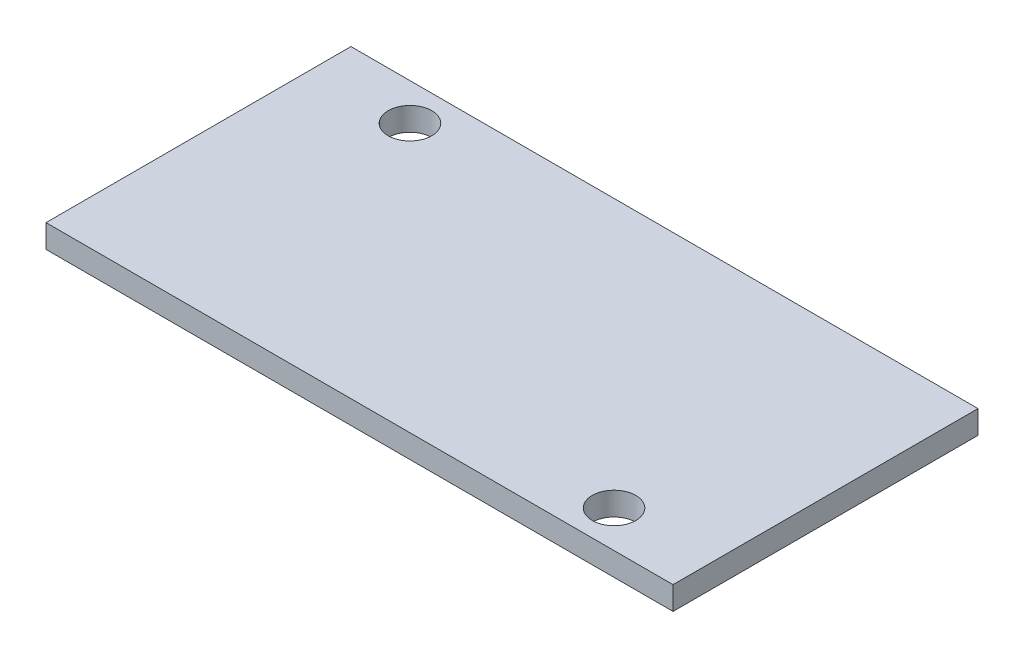
ISO-10303-21;
HEADER;
FILE_DESCRIPTION(('STEP AP214'),'2;1');
FILE_NAME('part.step','',(''),(''),'','','');
FILE_SCHEMA(('AUTOMOTIVE_DESIGN { 1 0 10303 214 1 1 1 1 }'));
ENDSEC;
DATA;
#1=APPLICATION_CONTEXT('core data for automotive mechanical design processes');
#2=APPLICATION_PROTOCOL_DEFINITION('international standard','automotive_design',2000,#1);
#3=PRODUCT_CONTEXT('',#1,'mechanical');
#4=PRODUCT('Part','Part','',(#3));
#5=PRODUCT_RELATED_PRODUCT_CATEGORY('part','',(#4));
#6=PRODUCT_DEFINITION_FORMATION('','',#4);
#7=PRODUCT_DEFINITION_CONTEXT('part definition',#1,'design');
#8=PRODUCT_DEFINITION('design','',#6,#7);
#9=PRODUCT_DEFINITION_SHAPE('','',#8);
#10=(LENGTH_UNIT() NAMED_UNIT(*) SI_UNIT(.MILLI.,.METRE.));
#11=(NAMED_UNIT(*) PLANE_ANGLE_UNIT() SI_UNIT($,.RADIAN.));
#12=(NAMED_UNIT(*) SI_UNIT($,.STERADIAN.) SOLID_ANGLE_UNIT());
#13=UNCERTAINTY_MEASURE_WITH_UNIT(LENGTH_MEASURE(1.E-05),#10,'distance_accuracy_value','');
#14=(GEOMETRIC_REPRESENTATION_CONTEXT(3) GLOBAL_UNCERTAINTY_ASSIGNED_CONTEXT((#13)) GLOBAL_UNIT_ASSIGNED_CONTEXT((#10,
#11,#12)) REPRESENTATION_CONTEXT('',''));
#15=CARTESIAN_POINT('',(0.,0.,0.));
#16=DIRECTION('',(0.,0.,1.));
#17=DIRECTION('',(1.,0.,0.));
#18=AXIS2_PLACEMENT_3D('',#15,#16,#17);
#19=CARTESIAN_POINT('',(-21.59,1.6,-10.5));
#20=DIRECTION('',(1.,0.,0.));
#21=DIRECTION('',(0.,0.,-1.));
#22=AXIS2_PLACEMENT_3D('',#19,#20,#21);
#23=PLANE('',#22);
#24=DIRECTION('',(0.,0.,1.));
#25=VECTOR('',#24,1.);
#26=CARTESIAN_POINT('',(-21.59,0.,-10.5));
#27=LINE('',#26,#25);
#28=CARTESIAN_POINT('',(-21.59,0.,-10.5));
#29=VERTEX_POINT('',#28);
#30=CARTESIAN_POINT('',(-21.59,0.,10.5));
#31=VERTEX_POINT('',#30);
#32=EDGE_CURVE('E103',#29,#31,#27,.T.);
#33=ORIENTED_EDGE('',*,*,#32,.T.);
#34=DIRECTION('',(0.,-1.,0.));
#35=VECTOR('',#34,1.);
#36=CARTESIAN_POINT('',(-21.59,1.6,10.5));
#37=LINE('',#36,#35);
#38=CARTESIAN_POINT('',(-21.59,1.6,10.5));
#39=VERTEX_POINT('',#38);
#40=EDGE_CURVE('E11',#39,#31,#37,.T.);
#41=ORIENTED_EDGE('',*,*,#40,.F.);
#42=DIRECTION('',(0.,0.,1.));
#43=VECTOR('',#42,1.);
#44=CARTESIAN_POINT('',(-21.59,1.6,-10.5));
#45=LINE('',#44,#43);
#46=CARTESIAN_POINT('',(-21.59,1.6,-10.5));
#47=VERTEX_POINT('',#46);
#48=EDGE_CURVE('E90',#47,#39,#45,.T.);
#49=ORIENTED_EDGE('',*,*,#48,.F.);
#50=DIRECTION('',(0.,-1.,0.));
#51=VECTOR('',#50,1.);
#52=CARTESIAN_POINT('',(-21.59,1.6,-10.5));
#53=LINE('',#52,#51);
#54=EDGE_CURVE('E99',#47,#29,#53,.T.);
#55=ORIENTED_EDGE('',*,*,#54,.T.);
#56=EDGE_LOOP('',(#33,#41,#49,#55));
#57=FACE_BOUND('',#56,.T.);
#58=ADVANCED_FACE('F37',(#57),#23,.F.);
#59=CARTESIAN_POINT('',(-21.59,1.6,10.5));
#60=DIRECTION('',(0.,0.,-1.));
#61=DIRECTION('',(-1.,0.,0.));
#62=AXIS2_PLACEMENT_3D('',#59,#60,#61);
#63=PLANE('',#62);
#64=DIRECTION('',(1.,0.,0.));
#65=VECTOR('',#64,1.);
#66=CARTESIAN_POINT('',(-21.59,0.,10.5));
#67=LINE('',#66,#65);
#68=CARTESIAN_POINT('',(21.59,0.,10.5));
#69=VERTEX_POINT('',#68);
#70=EDGE_CURVE('E94',#31,#69,#67,.T.);
#71=ORIENTED_EDGE('',*,*,#70,.T.);
#72=DIRECTION('',(0.,-1.,0.));
#73=VECTOR('',#72,1.);
#74=CARTESIAN_POINT('',(21.59,1.6,10.5));
#75=LINE('',#74,#73);
#76=CARTESIAN_POINT('',(21.59,1.6,10.5));
#77=VERTEX_POINT('',#76);
#78=EDGE_CURVE('E46',#77,#69,#75,.T.);
#79=ORIENTED_EDGE('',*,*,#78,.F.);
#80=DIRECTION('',(1.,0.,0.));
#81=VECTOR('',#80,1.);
#82=CARTESIAN_POINT('',(-21.59,1.6,10.5));
#83=LINE('',#82,#81);
#84=EDGE_CURVE('E85',#39,#77,#83,.T.);
#85=ORIENTED_EDGE('',*,*,#84,.F.);
#86=ORIENTED_EDGE('',*,*,#40,.T.);
#87=EDGE_LOOP('',(#71,#79,#85,#86));
#88=FACE_BOUND('',#87,.T.);
#89=ADVANCED_FACE('F93',(#88),#63,.F.);
#90=CARTESIAN_POINT('',(21.59,1.6,-10.5));
#91=DIRECTION('',(-1.,0.,0.));
#92=DIRECTION('',(0.,0.,1.));
#93=AXIS2_PLACEMENT_3D('',#90,#91,#92);
#94=PLANE('',#93);
#95=DIRECTION('',(0.,0.,-1.));
#96=VECTOR('',#95,1.);
#97=CARTESIAN_POINT('',(21.59,0.,-10.5));
#98=LINE('',#97,#96);
#99=CARTESIAN_POINT('',(21.59,0.,-10.5));
#100=VERTEX_POINT('',#99);
#101=EDGE_CURVE('E72',#69,#100,#98,.T.);
#102=ORIENTED_EDGE('',*,*,#101,.T.);
#103=DIRECTION('',(0.,-1.,0.));
#104=VECTOR('',#103,1.);
#105=CARTESIAN_POINT('',(21.59,1.6,-10.5));
#106=LINE('',#105,#104);
#107=CARTESIAN_POINT('',(21.59,1.6,-10.5));
#108=VERTEX_POINT('',#107);
#109=EDGE_CURVE('E95',#108,#100,#106,.T.);
#110=ORIENTED_EDGE('',*,*,#109,.F.);
#111=DIRECTION('',(0.,0.,-1.));
#112=VECTOR('',#111,1.);
#113=CARTESIAN_POINT('',(21.59,1.6,-10.5));
#114=LINE('',#113,#112);
#115=EDGE_CURVE('E88',#77,#108,#114,.T.);
#116=ORIENTED_EDGE('',*,*,#115,.F.);
#117=ORIENTED_EDGE('',*,*,#78,.T.);
#118=EDGE_LOOP('',(#102,#110,#116,#117));
#119=FACE_BOUND('',#118,.T.);
#120=ADVANCED_FACE('F97',(#119),#94,.F.);
#121=CARTESIAN_POINT('',(-21.59,1.6,-10.5));
#122=DIRECTION('',(0.,0.,1.));
#123=DIRECTION('',(1.,0.,0.));
#124=AXIS2_PLACEMENT_3D('',#121,#122,#123);
#125=PLANE('',#124);
#126=DIRECTION('',(-1.,0.,0.));
#127=VECTOR('',#126,1.);
#128=CARTESIAN_POINT('',(-21.59,0.,-10.5));
#129=LINE('',#128,#127);
#130=EDGE_CURVE('E78',#100,#29,#129,.T.);
#131=ORIENTED_EDGE('',*,*,#130,.T.);
#132=ORIENTED_EDGE('',*,*,#54,.F.);
#133=DIRECTION('',(-1.,0.,0.));
#134=VECTOR('',#133,1.);
#135=CARTESIAN_POINT('',(-21.59,1.6,-10.5));
#136=LINE('',#135,#134);
#137=EDGE_CURVE('E55',#108,#47,#136,.T.);
#138=ORIENTED_EDGE('',*,*,#137,.F.);
#139=ORIENTED_EDGE('',*,*,#109,.T.);
#140=EDGE_LOOP('',(#131,#132,#138,#139));
#141=FACE_BOUND('',#140,.T.);
#142=ADVANCED_FACE('F131',(#141),#125,.F.);
#143=CARTESIAN_POINT('',(0.,1.6,0.));
#144=DIRECTION('',(0.,1.,0.));
#145=DIRECTION('',(0.,0.,1.));
#146=AXIS2_PLACEMENT_3D('',#143,#144,#145);
#147=PLANE('',#146);
#148=CARTESIAN_POINT('',(14.986,1.6,7.96));
#149=DIRECTION('',(0.,1.,0.));
#150=DIRECTION('',(0.,0.,1.));
#151=AXIS2_PLACEMENT_3D('',#148,#149,#150);
#152=CIRCLE('',#151,1.5);
#153=CARTESIAN_POINT('',(14.986,1.6,9.46));
#154=VERTEX_POINT('',#153);
#155=EDGE_CURVE('E120',#154,#154,#152,.T.);
#156=ORIENTED_EDGE('',*,*,#155,.F.);
#157=EDGE_LOOP('',(#156));
#158=FACE_BOUND('',#157,.T.);
#159=CARTESIAN_POINT('',(-14.986,1.6,-7.96));
#160=DIRECTION('',(0.,1.,0.));
#161=DIRECTION('',(0.,0.,1.));
#162=AXIS2_PLACEMENT_3D('',#159,#160,#161);
#163=CIRCLE('',#162,1.5);
#164=CARTESIAN_POINT('',(-14.986,1.6,-6.45999999999999));
#165=VERTEX_POINT('',#164);
#166=EDGE_CURVE('E112',#165,#165,#163,.T.);
#167=ORIENTED_EDGE('',*,*,#166,.F.);
#168=EDGE_LOOP('',(#167));
#169=FACE_BOUND('',#168,.T.);
#170=ORIENTED_EDGE('',*,*,#48,.T.);
#171=ORIENTED_EDGE('',*,*,#84,.T.);
#172=ORIENTED_EDGE('',*,*,#115,.T.);
#173=ORIENTED_EDGE('',*,*,#137,.T.);
#174=EDGE_LOOP('',(#170,#171,#172,#173));
#175=FACE_BOUND('',#174,.T.);
#176=ADVANCED_FACE('F86',(#158,#169,#175),#147,.T.);
#177=CARTESIAN_POINT('',(0.,0.,0.));
#178=DIRECTION('',(0.,1.,0.));
#179=DIRECTION('',(0.,0.,1.));
#180=AXIS2_PLACEMENT_3D('',#177,#178,#179);
#181=PLANE('',#180);
#182=CARTESIAN_POINT('',(14.986,0.,7.96));
#183=DIRECTION('',(0.,1.,0.));
#184=DIRECTION('',(0.,0.,1.));
#185=AXIS2_PLACEMENT_3D('',#182,#183,#184);
#186=CIRCLE('',#185,1.5);
#187=CARTESIAN_POINT('',(14.986,0.,9.46));
#188=VERTEX_POINT('',#187);
#189=EDGE_CURVE('E40',#188,#188,#186,.T.);
#190=ORIENTED_EDGE('',*,*,#189,.T.);
#191=EDGE_LOOP('',(#190));
#192=FACE_BOUND('',#191,.T.);
#193=CARTESIAN_POINT('',(-14.986,0.,-7.96));
#194=DIRECTION('',(0.,1.,0.));
#195=DIRECTION('',(0.,0.,1.));
#196=AXIS2_PLACEMENT_3D('',#193,#194,#195);
#197=CIRCLE('',#196,1.5);
#198=CARTESIAN_POINT('',(-14.986,0.,-6.45999999999999));
#199=VERTEX_POINT('',#198);
#200=EDGE_CURVE('E106',#199,#199,#197,.T.);
#201=ORIENTED_EDGE('',*,*,#200,.T.);
#202=EDGE_LOOP('',(#201));
#203=FACE_BOUND('',#202,.T.);
#204=ORIENTED_EDGE('',*,*,#32,.F.);
#205=ORIENTED_EDGE('',*,*,#130,.F.);
#206=ORIENTED_EDGE('',*,*,#101,.F.);
#207=ORIENTED_EDGE('',*,*,#70,.F.);
#208=EDGE_LOOP('',(#204,#205,#206,#207));
#209=FACE_BOUND('',#208,.T.);
#210=ADVANCED_FACE('F130',(#192,#203,#209),#181,.F.);
#211=CARTESIAN_POINT('',(-14.986,-8.4,-7.96));
#212=DIRECTION('',(0.,1.,0.));
#213=DIRECTION('',(0.,0.,1.));
#214=AXIS2_PLACEMENT_3D('',#211,#212,#213);
#215=CYLINDRICAL_SURFACE('',#214,1.5);
#216=ORIENTED_EDGE('',*,*,#166,.T.);
#217=EDGE_LOOP('',(#216));
#218=FACE_BOUND('',#217,.T.);
#219=ORIENTED_EDGE('',*,*,#200,.F.);
#220=EDGE_LOOP('',(#219));
#221=FACE_BOUND('',#220,.T.);
#222=ADVANCED_FACE('F137',(#218,#221),#215,.F.);
#223=CARTESIAN_POINT('',(14.986,-8.4,7.96));
#224=DIRECTION('',(0.,1.,0.));
#225=DIRECTION('',(0.,0.,1.));
#226=AXIS2_PLACEMENT_3D('',#223,#224,#225);
#227=CYLINDRICAL_SURFACE('',#226,1.5);
#228=ORIENTED_EDGE('',*,*,#155,.T.);
#229=EDGE_LOOP('',(#228));
#230=FACE_BOUND('',#229,.T.);
#231=ORIENTED_EDGE('',*,*,#189,.F.);
#232=EDGE_LOOP('',(#231));
#233=FACE_BOUND('',#232,.T.);
#234=ADVANCED_FACE('F125',(#230,#233),#227,.F.);
#235=CLOSED_SHELL('',(#58,#89,#120,#142,#176,#210,#222,#234));
#236=MANIFOLD_SOLID_BREP('B2',#235);
#237=ADVANCED_BREP_SHAPE_REPRESENTATION('',(#18,#236),#14);
#238=SHAPE_DEFINITION_REPRESENTATION(#9,#237);
ENDSEC;
END-ISO-10303-21;
